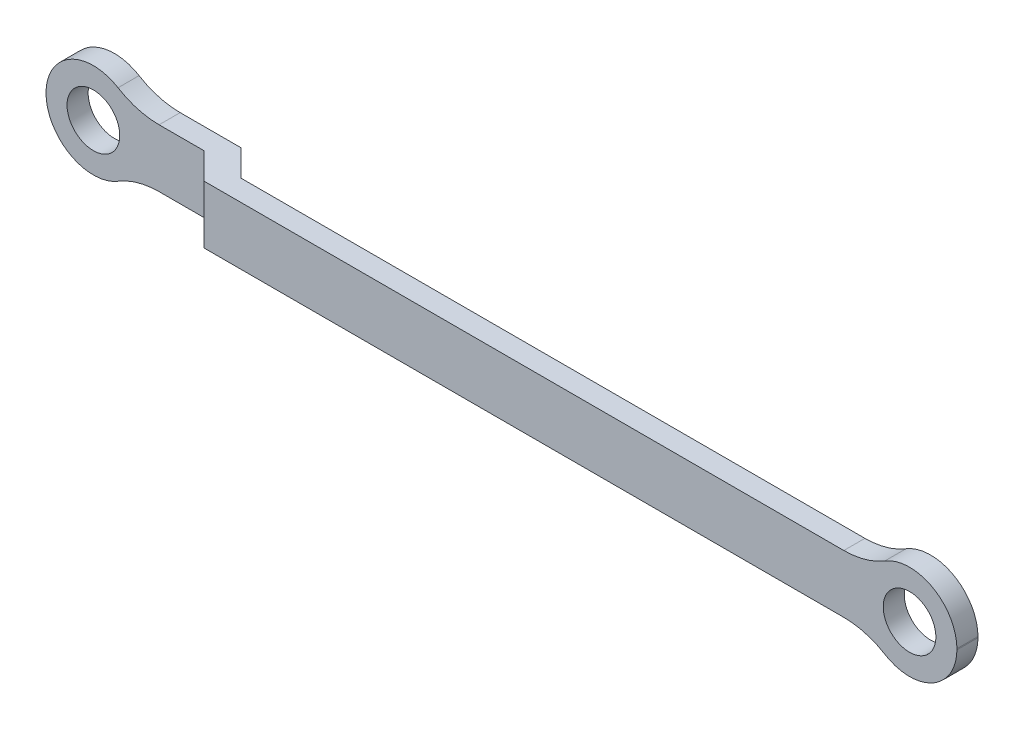
ISO-10303-21;
HEADER;
FILE_DESCRIPTION(('STEP AP214'),'2;1');
FILE_NAME('part.step','',(''),(''),'','','');
FILE_SCHEMA(('AUTOMOTIVE_DESIGN { 1 0 10303 214 1 1 1 1 }'));
ENDSEC;
DATA;
#1=APPLICATION_CONTEXT('core data for automotive mechanical design processes');
#2=APPLICATION_PROTOCOL_DEFINITION('international standard','automotive_design',2000,#1);
#3=PRODUCT_CONTEXT('',#1,'mechanical');
#4=PRODUCT('Part','Part','',(#3));
#5=PRODUCT_RELATED_PRODUCT_CATEGORY('part','',(#4));
#6=PRODUCT_DEFINITION_FORMATION('','',#4);
#7=PRODUCT_DEFINITION_CONTEXT('part definition',#1,'design');
#8=PRODUCT_DEFINITION('design','',#6,#7);
#9=PRODUCT_DEFINITION_SHAPE('','',#8);
#10=(LENGTH_UNIT() NAMED_UNIT(*) SI_UNIT(.MILLI.,.METRE.));
#11=(NAMED_UNIT(*) PLANE_ANGLE_UNIT() SI_UNIT($,.RADIAN.));
#12=(NAMED_UNIT(*) SI_UNIT($,.STERADIAN.) SOLID_ANGLE_UNIT());
#13=UNCERTAINTY_MEASURE_WITH_UNIT(LENGTH_MEASURE(1.E-05),#10,'distance_accuracy_value','');
#14=(GEOMETRIC_REPRESENTATION_CONTEXT(3) GLOBAL_UNCERTAINTY_ASSIGNED_CONTEXT((#13)) GLOBAL_UNIT_ASSIGNED_CONTEXT((#10,
#11,#12)) REPRESENTATION_CONTEXT('',''));
#15=CARTESIAN_POINT('',(0.,0.,0.));
#16=DIRECTION('',(0.,0.,1.));
#17=DIRECTION('',(1.,0.,0.));
#18=AXIS2_PLACEMENT_3D('',#15,#16,#17);
#19=CARTESIAN_POINT('',(12.4802934258492,-20.499811608978,9.));
#20=DIRECTION('',(0.,0.,1.));
#21=DIRECTION('',(1.,0.,0.));
#22=AXIS2_PLACEMENT_3D('',#19,#20,#21);
#23=PLANE('',#22);
#24=CARTESIAN_POINT('',(159.999999989477,0.0024151852392202,9.));
#25=DIRECTION('',(0.,0.,1.));
#26=DIRECTION('',(1.,0.,0.));
#27=AXIS2_PLACEMENT_3D('',#24,#25,#26);
#28=CIRCLE('',#27,4.99999999999999);
#29=CARTESIAN_POINT('',(164.999999989477,0.0024151852392202,9.));
#30=VERTEX_POINT('',#29);
#31=EDGE_CURVE('E296',#30,#30,#28,.T.);
#32=ORIENTED_EDGE('',*,*,#31,.F.);
#33=EDGE_LOOP('',(#32));
#34=FACE_BOUND('',#33,.T.);
#35=DIRECTION('',(-1.50950460063093E-05,0.99999999988607,0.));
#36=VECTOR('',#35,1.);
#37=CARTESIAN_POINT('',(26.0006914464936,-9.00215857277789,9.));
#38=LINE('',#37,#36);
#39=CARTESIAN_POINT('',(26.0006385753243,-5.4996075170369,9.));
#40=VERTEX_POINT('',#39);
#41=CARTESIAN_POINT('',(26.0004725298182,5.50039248167176,9.));
#42=VERTEX_POINT('',#41);
#43=EDGE_CURVE('E154',#40,#42,#38,.T.);
#44=ORIENTED_EDGE('',*,*,#43,.F.);
#45=DIRECTION('',(0.99999999988607,1.50950460063099E-05,0.));
#46=VECTOR('',#45,1.);
#47=CARTESIAN_POINT('',(12.4800669968452,-5.49981161068693,9.));
#48=LINE('',#47,#46);
#49=CARTESIAN_POINT('',(147.520099032764,-5.49777317519043,9.));
#50=VERTEX_POINT('',#49);
#51=EDGE_CURVE('E190',#40,#50,#48,.T.);
#52=ORIENTED_EDGE('',*,*,#51,.T.);
#53=CARTESIAN_POINT('',(147.520325424131,-20.4977731734821,9.));
#54=DIRECTION('',(0.,0.,-1.));
#55=DIRECTION('',(1.,0.,0.));
#56=AXIS2_PLACEMENT_3D('',#53,#54,#55);
#57=CIRCLE('',#56,15.0000000000002);
#58=CARTESIAN_POINT('',(155.320122044492,-7.68515545964208,9.));
#59=VERTEX_POINT('',#58);
#60=EDGE_CURVE('E251',#50,#59,#57,.T.);
#61=ORIENTED_EDGE('',*,*,#60,.T.);
#62=CARTESIAN_POINT('',(159.999999989477,0.0024151852392202,9.));
#63=DIRECTION('',(0.,0.,1.));
#64=DIRECTION('',(1.,0.,0.));
#65=AXIS2_PLACEMENT_3D('',#62,#63,#64);
#66=CIRCLE('',#65,8.9999999999999);
#67=CARTESIAN_POINT('',(168.999445942399,-0.0974474225182434,9.));
#68=VERTEX_POINT('',#67);
#69=EDGE_CURVE('E249',#59,#68,#66,.T.);
#70=ORIENTED_EDGE('',*,*,#69,.T.);
#71=DIRECTION('',(-1.50950459884477E-05,0.99999999988607,0.));
#72=VECTOR('',#71,1.);
#73=CARTESIAN_POINT('',(168.999442923436,0.102549491015377,9.));
#74=LINE('',#73,#72);
#75=CARTESIAN_POINT('',(168.999442923436,0.102549491015377,9.));
#76=VERTEX_POINT('',#75);
#77=EDGE_CURVE('E247',#68,#76,#74,.T.);
#78=ORIENTED_EDGE('',*,*,#77,.T.);
#79=CARTESIAN_POINT('',(159.999999989477,0.0024151852392202,9.));
#80=DIRECTION('',(0.,0.,1.));
#81=DIRECTION('',(1.,0.,0.));
#82=AXIS2_PLACEMENT_3D('',#79,#80,#81);
#83=CIRCLE('',#82,9.00000000004393);
#84=CARTESIAN_POINT('',(155.319889954743,7.68984453864324,9.));
#85=VERTEX_POINT('',#84);
#86=EDGE_CURVE('E243',#76,#85,#83,.T.);
#87=ORIENTED_EDGE('',*,*,#86,.T.);
#88=CARTESIAN_POINT('',(147.519706604641,20.5022268367107,9.));
#89=DIRECTION('',(0.,0.,-1.));
#90=DIRECTION('',(1.,0.,0.));
#91=AXIS2_PLACEMENT_3D('',#88,#89,#90);
#92=CIRCLE('',#91,15.0000000149014);
#93=CARTESIAN_POINT('',(147.519937563292,5.50222682358731,9.));
#94=VERTEX_POINT('',#93);
#95=EDGE_CURVE('E241',#85,#94,#92,.T.);
#96=ORIENTED_EDGE('',*,*,#95,.T.);
#97=DIRECTION('',(-0.99999999988607,-1.50950460063093E-05,0.));
#98=VECTOR('',#97,1.);
#99=CARTESIAN_POINT('',(147.519937563292,5.50222682358731,9.));
#100=LINE('',#99,#98);
#101=EDGE_CURVE('E194',#94,#42,#100,.T.);
#102=ORIENTED_EDGE('',*,*,#101,.T.);
#103=EDGE_LOOP('',(#44,#52,#61,#70,#78,#87,#96,#102));
#104=FACE_BOUND('',#103,.T.);
#105=ADVANCED_FACE('F35',(#34,#104),#23,.T.);
#106=CARTESIAN_POINT('',(12.4802934258492,-20.499811608978,0.));
#107=DIRECTION('',(0.,0.,1.));
#108=DIRECTION('',(1.,0.,0.));
#109=AXIS2_PLACEMENT_3D('',#106,#107,#108);
#110=PLANE('',#109);
#111=CARTESIAN_POINT('',(-4.42840208947359E-11,0.,0.));
#112=DIRECTION('',(0.,0.,1.));
#113=DIRECTION('',(1.,0.,0.));
#114=AXIS2_PLACEMENT_3D('',#111,#112,#113);
#115=CIRCLE('',#114,5.00000000004418);
#116=CARTESIAN_POINT('',(4.99999999999989,0.,0.));
#117=VERTEX_POINT('',#116);
#118=EDGE_CURVE('E175',#117,#117,#115,.T.);
#119=ORIENTED_EDGE('',*,*,#118,.T.);
#120=EDGE_LOOP('',(#119));
#121=FACE_BOUND('',#120,.T.);
#122=DIRECTION('',(-0.99999999988607,-1.50950460063093E-05,0.));
#123=VECTOR('',#122,1.);
#124=CARTESIAN_POINT('',(147.519937563292,5.50222682358731,0.));
#125=LINE('',#124,#123);
#126=CARTESIAN_POINT('',(24.000472530046,5.50036229157975,0.));
#127=VERTEX_POINT('',#126);
#128=CARTESIAN_POINT('',(12.4799009488955,5.50018838802169,0.));
#129=VERTEX_POINT('',#128);
#130=EDGE_CURVE('E165',#127,#129,#125,.T.);
#131=ORIENTED_EDGE('',*,*,#130,.F.);
#132=DIRECTION('',(-1.50950460063093E-05,0.99999999988607,0.));
#133=VECTOR('',#132,1.);
#134=CARTESIAN_POINT('',(24.0006914467214,-9.0021887628699,0.));
#135=LINE('',#134,#133);
#136=CARTESIAN_POINT('',(24.0006385755521,-5.49963770712892,0.));
#137=VERTEX_POINT('',#136);
#138=EDGE_CURVE('E51',#137,#127,#135,.T.);
#139=ORIENTED_EDGE('',*,*,#138,.F.);
#140=DIRECTION('',(0.99999999988607,1.50950460063099E-05,0.));
#141=VECTOR('',#140,1.);
#142=CARTESIAN_POINT('',(12.4800669968452,-5.49981161068693,0.));
#143=LINE('',#142,#141);
#144=CARTESIAN_POINT('',(12.4800669968452,-5.49981161068693,0.));
#145=VERTEX_POINT('',#144);
#146=EDGE_CURVE('E162',#145,#137,#143,.T.);
#147=ORIENTED_EDGE('',*,*,#146,.F.);
#148=CARTESIAN_POINT('',(12.4802934258492,-20.499811608978,0.));
#149=DIRECTION('',(0.,0.,-1.));
#150=DIRECTION('',(1.,0.,0.));
#151=AXIS2_PLACEMENT_3D('',#148,#149,#150);
#152=CIRCLE('',#151,15.0000000000001);
#153=CARTESIAN_POINT('',(4.68011003466512,-7.68742935336687,0.));
#154=VERTEX_POINT('',#153);
#155=EDGE_CURVE('E171',#154,#145,#152,.T.);
#156=ORIENTED_EDGE('',*,*,#155,.F.);
#157=CARTESIAN_POINT('',(-4.42840208947359E-11,0.,0.));
#158=DIRECTION('',(0.,0.,1.));
#159=DIRECTION('',(1.,0.,0.));
#160=AXIS2_PLACEMENT_3D('',#157,#158,#159);
#161=CIRCLE('',#160,8.99999999999968);
#162=CARTESIAN_POINT('',(-8.99944293395975,-0.100134305776101,0.));
#163=VERTEX_POINT('',#162);
#164=EDGE_CURVE('E187',#163,#154,#161,.T.);
#165=ORIENTED_EDGE('',*,*,#164,.F.);
#166=DIRECTION('',(1.50950459891432E-05,-0.99999999988607,0.));
#167=VECTOR('',#166,1.);
#168=CARTESIAN_POINT('',(-8.99944595292236,0.0998626077483031,0.));
#169=LINE('',#168,#167);
#170=CARTESIAN_POINT('',(-8.99944595292236,0.099862607748304,0.));
#171=VERTEX_POINT('',#170);
#172=EDGE_CURVE('E184',#171,#163,#169,.T.);
#173=ORIENTED_EDGE('',*,*,#172,.F.);
#174=CARTESIAN_POINT('',(-4.42840208947359E-11,0.,0.));
#175=DIRECTION('',(0.,0.,1.));
#176=DIRECTION('',(1.,0.,0.));
#177=AXIS2_PLACEMENT_3D('',#174,#175,#176);
#178=CIRCLE('',#177,8.99999999995555);
#179=CARTESIAN_POINT('',(4.67987794491722,7.68757064484371,0.));
#180=VERTEX_POINT('',#179);
#181=EDGE_CURVE('E181',#180,#171,#178,.T.);
#182=ORIENTED_EDGE('',*,*,#181,.F.);
#183=CARTESIAN_POINT('',(12.4796745198924,20.5001883863128,0.));
#184=DIRECTION('',(0.,0.,-1.));
#185=DIRECTION('',(1.,0.,0.));
#186=AXIS2_PLACEMENT_3D('',#183,#184,#185);
#187=CIRCLE('',#186,15.0000000000001);
#188=EDGE_CURVE('E173',#129,#180,#187,.T.);
#189=ORIENTED_EDGE('',*,*,#188,.F.);
#190=EDGE_LOOP('',(#131,#139,#147,#156,#165,#173,#182,#189));
#191=FACE_BOUND('',#190,.T.);
#192=ADVANCED_FACE('F160',(#121,#191),#110,.F.);
#193=CARTESIAN_POINT('',(12.4802934258492,-20.499811608978,9.));
#194=DIRECTION('',(0.,0.,-1.));
#195=DIRECTION('',(-1.,0.,0.));
#196=AXIS2_PLACEMENT_3D('',#193,#194,#195);
#197=CYLINDRICAL_SURFACE('',#196,15.0000000000001);
#198=DIRECTION('',(0.,0.,-1.));
#199=VECTOR('',#198,1.);
#200=CARTESIAN_POINT('',(12.4800669968452,-5.49981161068693,9.));
#201=LINE('',#200,#199);
#202=CARTESIAN_POINT('',(12.4800669968452,-5.49981161068693,4.));
#203=VERTEX_POINT('',#202);
#204=EDGE_CURVE('E170',#203,#145,#201,.T.);
#205=ORIENTED_EDGE('',*,*,#204,.F.);
#206=CARTESIAN_POINT('',(12.4802934258492,-20.499811608978,4.));
#207=DIRECTION('',(0.,0.,-1.));
#208=DIRECTION('',(-1.,0.,0.));
#209=AXIS2_PLACEMENT_3D('',#206,#207,#208);
#210=CIRCLE('',#209,15.0000000000001);
#211=CARTESIAN_POINT('',(4.68011003466512,-7.68742935336687,4.));
#212=VERTEX_POINT('',#211);
#213=EDGE_CURVE('E268',#203,#212,#210,.F.);
#214=ORIENTED_EDGE('',*,*,#213,.T.);
#215=DIRECTION('',(0.,0.,-1.));
#216=VECTOR('',#215,1.);
#217=CARTESIAN_POINT('',(4.68011003466512,-7.68742935336687,9.));
#218=LINE('',#217,#216);
#219=EDGE_CURVE('E191',#212,#154,#218,.T.);
#220=ORIENTED_EDGE('',*,*,#219,.T.);
#221=ORIENTED_EDGE('',*,*,#155,.T.);
#222=EDGE_LOOP('',(#205,#214,#220,#221));
#223=FACE_BOUND('',#222,.T.);
#224=ADVANCED_FACE('F37',(#223),#197,.F.);
#225=CARTESIAN_POINT('',(12.4800669968452,-5.49981161068693,9.));
#226=DIRECTION('',(-1.50950460063099E-05,0.99999999988607,0.));
#227=DIRECTION('',(-0.99999999988607,-1.50950460063099E-05,0.));
#228=AXIS2_PLACEMENT_3D('',#225,#226,#227);
#229=PLANE('',#228);
#230=DIRECTION('',(0.707106781105991,1.06738093933847E-05,0.707106781186544));
#231=VECTOR('',#230,1.);
#232=CARTESIAN_POINT('',(22.7403527856859,-5.4996567312009,-1.26028579000979));
#233=LINE('',#232,#231);
#234=CARTESIAN_POINT('',(29.0006385749825,-5.49956223189888,5.00000000000002));
#235=VERTEX_POINT('',#234);
#236=EDGE_CURVE('E147',#137,#235,#233,.T.);
#237=ORIENTED_EDGE('',*,*,#236,.T.);
#238=DIRECTION('',(0.99999999988607,1.50950460063099E-05,0.));
#239=VECTOR('',#238,1.);
#240=CARTESIAN_POINT('',(12.4800669968452,-5.49981161068693,5.00000000000002));
#241=LINE('',#240,#239);
#242=CARTESIAN_POINT('',(147.520099032764,-5.49777317519043,5.));
#243=VERTEX_POINT('',#242);
#244=EDGE_CURVE('E155',#235,#243,#241,.T.);
#245=ORIENTED_EDGE('',*,*,#244,.T.);
#246=DIRECTION('',(0.,0.,-1.));
#247=VECTOR('',#246,1.);
#248=CARTESIAN_POINT('',(147.520099032764,-5.49777317519043,9.));
#249=LINE('',#248,#247);
#250=EDGE_CURVE('E218',#50,#243,#249,.T.);
#251=ORIENTED_EDGE('',*,*,#250,.F.);
#252=ORIENTED_EDGE('',*,*,#51,.F.);
#253=DIRECTION('',(-0.707106781105983,-1.06738093933846E-05,-0.707106781186551));
#254=VECTOR('',#253,1.);
#255=CARTESIAN_POINT('',(19.2403527860848,-5.49970956386192,2.23971420999023));
#256=LINE('',#255,#254);
#257=CARTESIAN_POINT('',(21.000638575894,-5.49968299226693,4.));
#258=VERTEX_POINT('',#257);
#259=EDGE_CURVE('E256',#40,#258,#256,.T.);
#260=ORIENTED_EDGE('',*,*,#259,.T.);
#261=DIRECTION('',(-0.99999999988607,-1.50950460063099E-05,0.));
#262=VECTOR('',#261,1.);
#263=CARTESIAN_POINT('',(12.4800669968452,-5.49981161068693,4.));
#264=LINE('',#263,#262);
#265=EDGE_CURVE('E266',#258,#203,#264,.T.);
#266=ORIENTED_EDGE('',*,*,#265,.T.);
#267=ORIENTED_EDGE('',*,*,#204,.T.);
#268=ORIENTED_EDGE('',*,*,#146,.T.);
#269=EDGE_LOOP('',(#237,#245,#251,#252,#260,#266,#267,#268));
#270=FACE_BOUND('',#269,.T.);
#271=ADVANCED_FACE('F167',(#270),#229,.F.);
#272=CARTESIAN_POINT('',(147.520325424131,-20.4977731734821,9.));
#273=DIRECTION('',(0.,0.,-1.));
#274=DIRECTION('',(-1.,0.,0.));
#275=AXIS2_PLACEMENT_3D('',#272,#273,#274);
#276=CYLINDRICAL_SURFACE('',#275,15.0000000000002);
#277=ORIENTED_EDGE('',*,*,#250,.T.);
#278=CARTESIAN_POINT('',(147.520325424131,-20.4977731734821,5.));
#279=DIRECTION('',(0.,0.,1.));
#280=DIRECTION('',(1.,0.,0.));
#281=AXIS2_PLACEMENT_3D('',#278,#279,#280);
#282=CIRCLE('',#281,15.0000000000002);
#283=CARTESIAN_POINT('',(155.320122044492,-7.68515545964208,5.));
#284=VERTEX_POINT('',#283);
#285=EDGE_CURVE('E277',#243,#284,#282,.F.);
#286=ORIENTED_EDGE('',*,*,#285,.T.);
#287=DIRECTION('',(0.,0.,-1.));
#288=VECTOR('',#287,1.);
#289=CARTESIAN_POINT('',(155.320122044492,-7.68515545964208,9.));
#290=LINE('',#289,#288);
#291=EDGE_CURVE('E215',#59,#284,#290,.T.);
#292=ORIENTED_EDGE('',*,*,#291,.F.);
#293=ORIENTED_EDGE('',*,*,#60,.F.);
#294=EDGE_LOOP('',(#277,#286,#292,#293));
#295=FACE_BOUND('',#294,.T.);
#296=ADVANCED_FACE('F358',(#295),#276,.F.);
#297=CARTESIAN_POINT('',(159.999999989477,0.0024151852392202,9.));
#298=DIRECTION('',(0.,0.,-1.));
#299=DIRECTION('',(-1.,0.,0.));
#300=AXIS2_PLACEMENT_3D('',#297,#298,#299);
#301=CYLINDRICAL_SURFACE('',#300,8.9999999999999);
#302=ORIENTED_EDGE('',*,*,#291,.T.);
#303=CARTESIAN_POINT('',(159.999999989477,0.0024151852392202,5.));
#304=DIRECTION('',(0.,0.,1.));
#305=DIRECTION('',(1.,0.,0.));
#306=AXIS2_PLACEMENT_3D('',#303,#304,#305);
#307=CIRCLE('',#306,8.9999999999999);
#308=CARTESIAN_POINT('',(168.999445942399,-0.0974474225182449,5.));
#309=VERTEX_POINT('',#308);
#310=EDGE_CURVE('E280',#284,#309,#307,.T.);
#311=ORIENTED_EDGE('',*,*,#310,.T.);
#312=DIRECTION('',(0.,0.,-1.));
#313=VECTOR('',#312,1.);
#314=CARTESIAN_POINT('',(168.999445942399,-0.0974474225182434,9.));
#315=LINE('',#314,#313);
#316=EDGE_CURVE('E212',#68,#309,#315,.T.);
#317=ORIENTED_EDGE('',*,*,#316,.F.);
#318=ORIENTED_EDGE('',*,*,#69,.F.);
#319=EDGE_LOOP('',(#302,#311,#317,#318));
#320=FACE_BOUND('',#319,.T.);
#321=ADVANCED_FACE('F354',(#320),#301,.T.);
#322=CARTESIAN_POINT('',(168.999442923436,0.102549491015377,9.));
#323=DIRECTION('',(-0.99999999988607,-1.50950459884477E-05,0.));
#324=DIRECTION('',(1.50950459884477E-05,-0.99999999988607,0.));
#325=AXIS2_PLACEMENT_3D('',#322,#323,#324);
#326=PLANE('',#325);
#327=ORIENTED_EDGE('',*,*,#316,.T.);
#328=DIRECTION('',(-1.50950460063093E-05,0.99999999988607,0.));
#329=VECTOR('',#328,1.);
#330=CARTESIAN_POINT('',(168.99958032684,-8.99999999797114,5.));
#331=LINE('',#330,#329);
#332=CARTESIAN_POINT('',(168.999442923436,0.102549491018608,5.));
#333=VERTEX_POINT('',#332);
#334=EDGE_CURVE('E291',#309,#333,#331,.T.);
#335=ORIENTED_EDGE('',*,*,#334,.T.);
#336=DIRECTION('',(0.,0.,-1.));
#337=VECTOR('',#336,1.);
#338=CARTESIAN_POINT('',(168.999442923436,0.102549491015377,9.));
#339=LINE('',#338,#337);
#340=EDGE_CURVE('E209',#76,#333,#339,.T.);
#341=ORIENTED_EDGE('',*,*,#340,.F.);
#342=ORIENTED_EDGE('',*,*,#77,.F.);
#343=EDGE_LOOP('',(#327,#335,#341,#342));
#344=FACE_BOUND('',#343,.T.);
#345=ADVANCED_FACE('F350',(#344),#326,.F.);
#346=CARTESIAN_POINT('',(159.999999989477,0.0024151852392202,9.));
#347=DIRECTION('',(0.,0.,-1.));
#348=DIRECTION('',(-1.,0.,0.));
#349=AXIS2_PLACEMENT_3D('',#346,#347,#348);
#350=CYLINDRICAL_SURFACE('',#349,9.00000000004393);
#351=ORIENTED_EDGE('',*,*,#340,.T.);
#352=CARTESIAN_POINT('',(159.999999989477,0.0024151852392202,5.));
#353=DIRECTION('',(0.,0.,1.));
#354=DIRECTION('',(1.,0.,0.));
#355=AXIS2_PLACEMENT_3D('',#352,#353,#354);
#356=CIRCLE('',#355,9.00000000004393);
#357=CARTESIAN_POINT('',(155.319889954743,7.68984453864324,5.));
#358=VERTEX_POINT('',#357);
#359=EDGE_CURVE('E283',#333,#358,#356,.T.);
#360=ORIENTED_EDGE('',*,*,#359,.T.);
#361=DIRECTION('',(0.,0.,-1.));
#362=VECTOR('',#361,1.);
#363=CARTESIAN_POINT('',(155.319889954743,7.68984453864324,9.));
#364=LINE('',#363,#362);
#365=EDGE_CURVE('E206',#85,#358,#364,.T.);
#366=ORIENTED_EDGE('',*,*,#365,.F.);
#367=ORIENTED_EDGE('',*,*,#86,.F.);
#368=EDGE_LOOP('',(#351,#360,#366,#367));
#369=FACE_BOUND('',#368,.T.);
#370=ADVANCED_FACE('F346',(#369),#350,.T.);
#371=CARTESIAN_POINT('',(147.519706604641,20.5022268367107,9.));
#372=DIRECTION('',(0.,0.,-1.));
#373=DIRECTION('',(-1.,0.,0.));
#374=AXIS2_PLACEMENT_3D('',#371,#372,#373);
#375=CYLINDRICAL_SURFACE('',#374,15.0000000149014);
#376=ORIENTED_EDGE('',*,*,#365,.T.);
#377=CARTESIAN_POINT('',(147.519706604641,20.5022268367107,5.));
#378=DIRECTION('',(0.,0.,1.));
#379=DIRECTION('',(1.,0.,0.));
#380=AXIS2_PLACEMENT_3D('',#377,#378,#379);
#381=CIRCLE('',#380,15.0000000149014);
#382=CARTESIAN_POINT('',(147.519937563292,5.50222682358731,5.));
#383=VERTEX_POINT('',#382);
#384=EDGE_CURVE('E286',#358,#383,#381,.F.);
#385=ORIENTED_EDGE('',*,*,#384,.T.);
#386=DIRECTION('',(0.,0.,-1.));
#387=VECTOR('',#386,1.);
#388=CARTESIAN_POINT('',(147.519937563292,5.50222682358731,9.));
#389=LINE('',#388,#387);
#390=EDGE_CURVE('E203',#94,#383,#389,.T.);
#391=ORIENTED_EDGE('',*,*,#390,.F.);
#392=ORIENTED_EDGE('',*,*,#95,.F.);
#393=EDGE_LOOP('',(#376,#385,#391,#392));
#394=FACE_BOUND('',#393,.T.);
#395=ADVANCED_FACE('F343',(#394),#375,.F.);
#396=CARTESIAN_POINT('',(147.519937563292,5.50222682358731,9.));
#397=DIRECTION('',(1.50950460063093E-05,-0.99999999988607,0.));
#398=DIRECTION('',(0.99999999988607,1.50950460063093E-05,0.));
#399=AXIS2_PLACEMENT_3D('',#396,#397,#398);
#400=PLANE('',#399);
#401=ORIENTED_EDGE('',*,*,#390,.T.);
#402=DIRECTION('',(-0.99999999988607,-1.50950460063093E-05,0.));
#403=VECTOR('',#402,1.);
#404=CARTESIAN_POINT('',(147.519937563292,5.50222682358731,5.));
#405=LINE('',#404,#403);
#406=CARTESIAN_POINT('',(29.0004725294764,5.50043776680978,5.00000000000002));
#407=VERTEX_POINT('',#406);
#408=EDGE_CURVE('E289',#383,#407,#405,.T.);
#409=ORIENTED_EDGE('',*,*,#408,.T.);
#410=DIRECTION('',(-0.707106781105991,-1.06738093933843E-05,-0.707106781186544));
#411=VECTOR('',#410,1.);
#412=CARTESIAN_POINT('',(90.260205046157,5.50136248529056,66.2597325236592));
#413=LINE('',#412,#411);
#414=EDGE_CURVE('E11',#407,#127,#413,.T.);
#415=ORIENTED_EDGE('',*,*,#414,.T.);
#416=ORIENTED_EDGE('',*,*,#130,.T.);
#417=DIRECTION('',(0.,0.,-1.));
#418=VECTOR('',#417,1.);
#419=CARTESIAN_POINT('',(12.4799009488955,5.50018838802169,9.));
#420=LINE('',#419,#418);
#421=CARTESIAN_POINT('',(12.4799009488955,5.50018838802169,4.));
#422=VERTEX_POINT('',#421);
#423=EDGE_CURVE('E200',#422,#129,#420,.T.);
#424=ORIENTED_EDGE('',*,*,#423,.F.);
#425=DIRECTION('',(0.99999999988607,1.50950460063093E-05,0.));
#426=VECTOR('',#425,1.);
#427=CARTESIAN_POINT('',(147.519937563292,5.50222682358731,4.));
#428=LINE('',#427,#426);
#429=CARTESIAN_POINT('',(21.0004725303879,5.50031700644173,3.99999999999999));
#430=VERTEX_POINT('',#429);
#431=EDGE_CURVE('E233',#422,#430,#428,.T.);
#432=ORIENTED_EDGE('',*,*,#431,.T.);
#433=DIRECTION('',(0.707106781105983,1.06738093933841E-05,0.707106781186551));
#434=VECTOR('',#433,1.);
#435=CARTESIAN_POINT('',(86.7602050465545,5.50130965262954,69.7597325236592));
#436=LINE('',#435,#434);
#437=EDGE_CURVE('E44',#430,#42,#436,.T.);
#438=ORIENTED_EDGE('',*,*,#437,.T.);
#439=ORIENTED_EDGE('',*,*,#101,.F.);
#440=EDGE_LOOP('',(#401,#409,#415,#416,#424,#432,#438,#439));
#441=FACE_BOUND('',#440,.T.);
#442=ADVANCED_FACE('F231',(#441),#400,.F.);
#443=CARTESIAN_POINT('',(12.4796745198924,20.5001883863128,9.));
#444=DIRECTION('',(0.,0.,-1.));
#445=DIRECTION('',(-1.,0.,0.));
#446=AXIS2_PLACEMENT_3D('',#443,#444,#445);
#447=CYLINDRICAL_SURFACE('',#446,15.0000000000001);
#448=DIRECTION('',(0.,0.,-1.));
#449=VECTOR('',#448,1.);
#450=CARTESIAN_POINT('',(4.67987794491722,7.68757064484371,9.));
#451=LINE('',#450,#449);
#452=CARTESIAN_POINT('',(4.67987794491722,7.68757064484371,4.));
#453=VERTEX_POINT('',#452);
#454=EDGE_CURVE('E198',#453,#180,#451,.T.);
#455=ORIENTED_EDGE('',*,*,#454,.F.);
#456=CARTESIAN_POINT('',(12.4796745198924,20.5001883863128,4.));
#457=DIRECTION('',(0.,0.,-1.));
#458=DIRECTION('',(-1.,0.,0.));
#459=AXIS2_PLACEMENT_3D('',#456,#457,#458);
#460=CIRCLE('',#459,15.0000000000001);
#461=EDGE_CURVE('E260',#453,#422,#460,.F.);
#462=ORIENTED_EDGE('',*,*,#461,.T.);
#463=ORIENTED_EDGE('',*,*,#423,.T.);
#464=ORIENTED_EDGE('',*,*,#188,.T.);
#465=EDGE_LOOP('',(#455,#462,#463,#464));
#466=FACE_BOUND('',#465,.T.);
#467=ADVANCED_FACE('F336',(#466),#447,.F.);
#468=CARTESIAN_POINT('',(-4.42840208947359E-11,0.,9.));
#469=DIRECTION('',(0.,0.,-1.));
#470=DIRECTION('',(-1.,0.,0.));
#471=AXIS2_PLACEMENT_3D('',#468,#469,#470);
#472=CYLINDRICAL_SURFACE('',#471,8.99999999995555);
#473=DIRECTION('',(0.,0.,-1.));
#474=VECTOR('',#473,1.);
#475=CARTESIAN_POINT('',(-8.99944595292236,0.099862607748304,9.));
#476=LINE('',#475,#474);
#477=CARTESIAN_POINT('',(-8.99944595292236,0.0998626077483022,4.));
#478=VERTEX_POINT('',#477);
#479=EDGE_CURVE('E196',#478,#171,#476,.T.);
#480=ORIENTED_EDGE('',*,*,#479,.F.);
#481=CARTESIAN_POINT('',(-4.42840208947359E-11,0.,4.));
#482=DIRECTION('',(0.,0.,-1.));
#483=DIRECTION('',(-1.,0.,0.));
#484=AXIS2_PLACEMENT_3D('',#481,#482,#483);
#485=CIRCLE('',#484,8.99999999995555);
#486=EDGE_CURVE('E263',#478,#453,#485,.T.);
#487=ORIENTED_EDGE('',*,*,#486,.T.);
#488=ORIENTED_EDGE('',*,*,#454,.T.);
#489=ORIENTED_EDGE('',*,*,#181,.T.);
#490=EDGE_LOOP('',(#480,#487,#488,#489));
#491=FACE_BOUND('',#490,.T.);
#492=ADVANCED_FACE('F332',(#491),#472,.T.);
#493=CARTESIAN_POINT('',(-8.99944595292236,0.0998626077483031,9.));
#494=DIRECTION('',(0.99999999988607,1.50950459891432E-05,0.));
#495=DIRECTION('',(-1.50950459891432E-05,0.99999999988607,0.));
#496=AXIS2_PLACEMENT_3D('',#493,#494,#495);
#497=PLANE('',#496);
#498=DIRECTION('',(0.,0.,-1.));
#499=VECTOR('',#498,1.);
#500=CARTESIAN_POINT('',(-8.99944293395975,-0.100134305776101,9.));
#501=LINE('',#500,#499);
#502=CARTESIAN_POINT('',(-8.99944293395975,-0.100134305776101,4.));
#503=VERTEX_POINT('',#502);
#504=EDGE_CURVE('E193',#503,#163,#501,.T.);
#505=ORIENTED_EDGE('',*,*,#504,.F.);
#506=DIRECTION('',(-1.50950460063093E-05,0.99999999988607,0.));
#507=VECTOR('',#506,1.);
#508=CARTESIAN_POINT('',(-8.99930854951876,-9.00268689938811,4.));
#509=LINE('',#508,#507);
#510=EDGE_CURVE('E58',#503,#478,#509,.T.);
#511=ORIENTED_EDGE('',*,*,#510,.T.);
#512=ORIENTED_EDGE('',*,*,#479,.T.);
#513=ORIENTED_EDGE('',*,*,#172,.T.);
#514=EDGE_LOOP('',(#505,#511,#512,#513));
#515=FACE_BOUND('',#514,.T.);
#516=ADVANCED_FACE('F328',(#515),#497,.F.);
#517=CARTESIAN_POINT('',(-4.42840208947359E-11,0.,9.));
#518=DIRECTION('',(0.,0.,-1.));
#519=DIRECTION('',(-1.,0.,0.));
#520=AXIS2_PLACEMENT_3D('',#517,#518,#519);
#521=CYLINDRICAL_SURFACE('',#520,8.99999999999968);
#522=ORIENTED_EDGE('',*,*,#219,.F.);
#523=CARTESIAN_POINT('',(-4.42840208947359E-11,0.,4.));
#524=DIRECTION('',(0.,0.,-1.));
#525=DIRECTION('',(-1.,0.,0.));
#526=AXIS2_PLACEMENT_3D('',#523,#524,#525);
#527=CIRCLE('',#526,8.99999999999968);
#528=EDGE_CURVE('E225',#212,#503,#527,.T.);
#529=ORIENTED_EDGE('',*,*,#528,.T.);
#530=ORIENTED_EDGE('',*,*,#504,.T.);
#531=ORIENTED_EDGE('',*,*,#164,.T.);
#532=EDGE_LOOP('',(#522,#529,#530,#531));
#533=FACE_BOUND('',#532,.T.);
#534=ADVANCED_FACE('F325',(#533),#521,.T.);
#535=CARTESIAN_POINT('',(-4.42840208947359E-11,0.,9.));
#536=DIRECTION('',(0.,0.,-1.));
#537=DIRECTION('',(-1.,0.,0.));
#538=AXIS2_PLACEMENT_3D('',#535,#536,#537);
#539=CYLINDRICAL_SURFACE('',#538,5.00000000004418);
#540=CARTESIAN_POINT('',(-4.42840208947359E-11,0.,4.));
#541=DIRECTION('',(0.,0.,-1.));
#542=DIRECTION('',(-1.,0.,0.));
#543=AXIS2_PLACEMENT_3D('',#540,#541,#542);
#544=CIRCLE('',#543,5.00000000004418);
#545=CARTESIAN_POINT('',(-5.00000000008846,0.,4.));
#546=VERTEX_POINT('',#545);
#547=EDGE_CURVE('E222',#546,#546,#544,.T.);
#548=ORIENTED_EDGE('',*,*,#547,.F.);
#549=EDGE_LOOP('',(#548));
#550=FACE_BOUND('',#549,.T.);
#551=ORIENTED_EDGE('',*,*,#118,.F.);
#552=EDGE_LOOP('',(#551));
#553=FACE_BOUND('',#552,.T.);
#554=ADVANCED_FACE('F322',(#550,#553),#539,.F.);
#555=CARTESIAN_POINT('',(21.0006914470633,-9.00223404800792,4.));
#556=DIRECTION('',(0.70710678110599,1.06738093933843E-05,-0.707106781186544));
#557=DIRECTION('',(-0.707106781226824,0.,-0.707106781146271));
#558=AXIS2_PLACEMENT_3D('',#555,#556,#557);
#559=PLANE('',#558);
#560=ORIENTED_EDGE('',*,*,#43,.T.);
#561=ORIENTED_EDGE('',*,*,#437,.F.);
#562=DIRECTION('',(-1.50950460063093E-05,0.99999999988607,0.));
#563=VECTOR('',#562,1.);
#564=CARTESIAN_POINT('',(21.0006914470633,-9.00223404800792,4.));
#565=LINE('',#564,#563);
#566=EDGE_CURVE('E273',#258,#430,#565,.T.);
#567=ORIENTED_EDGE('',*,*,#566,.F.);
#568=ORIENTED_EDGE('',*,*,#259,.F.);
#569=EDGE_LOOP('',(#560,#561,#567,#568));
#570=FACE_BOUND('',#569,.T.);
#571=ADVANCED_FACE('F381',(#570),#559,.F.);
#572=CARTESIAN_POINT('',(-8.99930854951876,-9.00268689938811,4.));
#573=DIRECTION('',(0.,0.,-1.));
#574=DIRECTION('',(-1.,0.,0.));
#575=AXIS2_PLACEMENT_3D('',#572,#573,#574);
#576=PLANE('',#575);
#577=ORIENTED_EDGE('',*,*,#547,.T.);
#578=EDGE_LOOP('',(#577));
#579=FACE_BOUND('',#578,.T.);
#580=ORIENTED_EDGE('',*,*,#461,.F.);
#581=ORIENTED_EDGE('',*,*,#486,.F.);
#582=ORIENTED_EDGE('',*,*,#510,.F.);
#583=ORIENTED_EDGE('',*,*,#528,.F.);
#584=ORIENTED_EDGE('',*,*,#213,.F.);
#585=ORIENTED_EDGE('',*,*,#265,.F.);
#586=ORIENTED_EDGE('',*,*,#566,.T.);
#587=ORIENTED_EDGE('',*,*,#431,.F.);
#588=EDGE_LOOP('',(#580,#581,#582,#583,#584,#585,#586,#587));
#589=FACE_BOUND('',#588,.T.);
#590=ADVANCED_FACE('F382',(#579,#589),#576,.F.);
#591=CARTESIAN_POINT('',(29.0006914461518,-9.00211328763987,5.00000000000002));
#592=DIRECTION('',(-0.707106781105983,-1.06738093933841E-05,0.707106781186551));
#593=DIRECTION('',(0.707106781226832,0.,0.707106781146263));
#594=AXIS2_PLACEMENT_3D('',#591,#592,#593);
#595=PLANE('',#594);
#596=ORIENTED_EDGE('',*,*,#138,.T.);
#597=ORIENTED_EDGE('',*,*,#414,.F.);
#598=DIRECTION('',(-1.50950460063093E-05,0.99999999988607,0.));
#599=VECTOR('',#598,1.);
#600=CARTESIAN_POINT('',(29.0006914461518,-9.00211328763987,5.00000000000002));
#601=LINE('',#600,#599);
#602=EDGE_CURVE('E150',#235,#407,#601,.T.);
#603=ORIENTED_EDGE('',*,*,#602,.F.);
#604=ORIENTED_EDGE('',*,*,#236,.F.);
#605=EDGE_LOOP('',(#596,#597,#603,#604));
#606=FACE_BOUND('',#605,.T.);
#607=ADVANCED_FACE('F148',(#606),#595,.F.);
#608=CARTESIAN_POINT('',(168.99958032684,-8.99999999797114,5.));
#609=DIRECTION('',(0.,0.,1.));
#610=DIRECTION('',(1.,0.,0.));
#611=AXIS2_PLACEMENT_3D('',#608,#609,#610);
#612=PLANE('',#611);
#613=CARTESIAN_POINT('',(159.999999989477,0.0024151852392202,5.));
#614=DIRECTION('',(0.,0.,1.));
#615=DIRECTION('',(1.,0.,0.));
#616=AXIS2_PLACEMENT_3D('',#613,#614,#615);
#617=CIRCLE('',#616,4.99999999999999);
#618=CARTESIAN_POINT('',(164.999999989477,0.0024151852392202,5.));
#619=VERTEX_POINT('',#618);
#620=EDGE_CURVE('E39',#619,#619,#617,.T.);
#621=ORIENTED_EDGE('',*,*,#620,.T.);
#622=EDGE_LOOP('',(#621));
#623=FACE_BOUND('',#622,.T.);
#624=ORIENTED_EDGE('',*,*,#602,.T.);
#625=ORIENTED_EDGE('',*,*,#408,.F.);
#626=ORIENTED_EDGE('',*,*,#384,.F.);
#627=ORIENTED_EDGE('',*,*,#359,.F.);
#628=ORIENTED_EDGE('',*,*,#334,.F.);
#629=ORIENTED_EDGE('',*,*,#310,.F.);
#630=ORIENTED_EDGE('',*,*,#285,.F.);
#631=ORIENTED_EDGE('',*,*,#244,.F.);
#632=EDGE_LOOP('',(#624,#625,#626,#627,#628,#629,#630,#631));
#633=FACE_BOUND('',#632,.T.);
#634=ADVANCED_FACE('F303',(#623,#633),#612,.F.);
#635=CARTESIAN_POINT('',(159.999999989477,0.0024151852392202,0.));
#636=DIRECTION('',(0.,0.,1.));
#637=DIRECTION('',(1.,0.,0.));
#638=AXIS2_PLACEMENT_3D('',#635,#636,#637);
#639=CYLINDRICAL_SURFACE('',#638,4.99999999999999);
#640=ORIENTED_EDGE('',*,*,#31,.T.);
#641=EDGE_LOOP('',(#640));
#642=FACE_BOUND('',#641,.T.);
#643=ORIENTED_EDGE('',*,*,#620,.F.);
#644=EDGE_LOOP('',(#643));
#645=FACE_BOUND('',#644,.T.);
#646=ADVANCED_FACE('F306',(#642,#645),#639,.F.);
#647=CLOSED_SHELL('',(#105,#192,#224,#271,#296,#321,#345,#370,#395,#442,#467,#492,#516,#534,
#554,#571,#590,#607,#634,#646));
#648=MANIFOLD_SOLID_BREP('B2',#647);
#649=ADVANCED_BREP_SHAPE_REPRESENTATION('',(#18,#648),#14);
#650=SHAPE_DEFINITION_REPRESENTATION(#9,#649);
ENDSEC;
END-ISO-10303-21;
